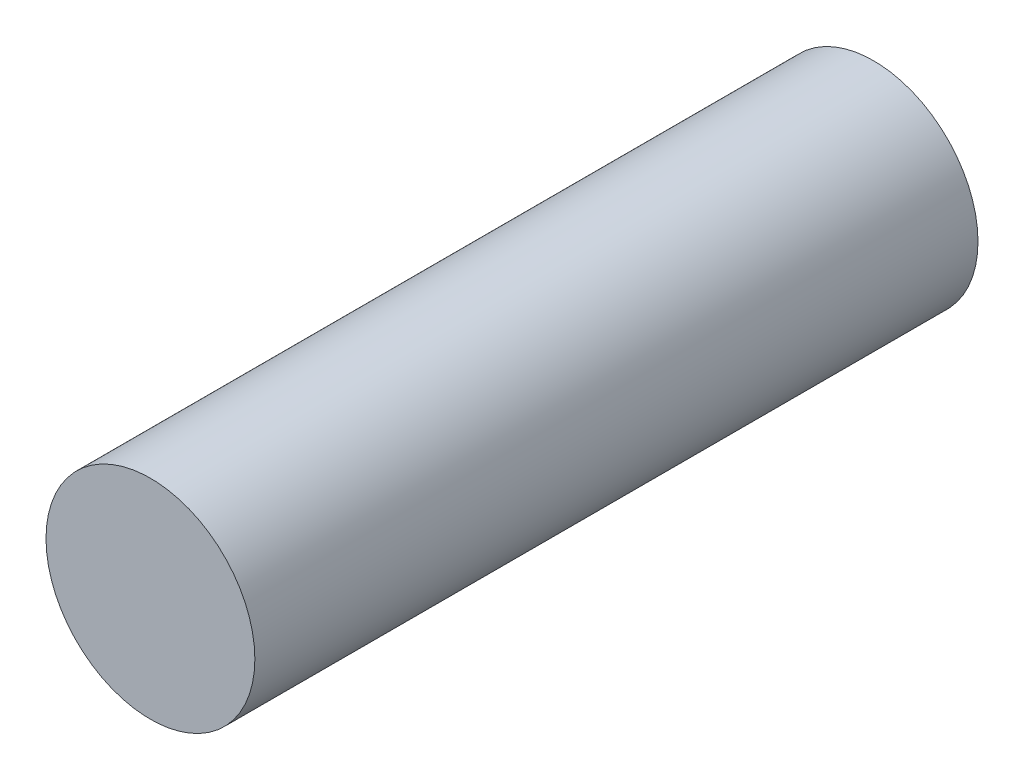
ISO-10303-21;
HEADER;
FILE_DESCRIPTION(('STEP AP214'),'2;1');
FILE_NAME('part.step','',(''),(''),'','','');
FILE_SCHEMA(('AUTOMOTIVE_DESIGN { 1 0 10303 214 1 1 1 1 }'));
ENDSEC;
DATA;
#1=APPLICATION_CONTEXT('core data for automotive mechanical design processes');
#2=APPLICATION_PROTOCOL_DEFINITION('international standard','automotive_design',2000,#1);
#3=PRODUCT_CONTEXT('',#1,'mechanical');
#4=PRODUCT('Part','Part','',(#3));
#5=PRODUCT_RELATED_PRODUCT_CATEGORY('part','',(#4));
#6=PRODUCT_DEFINITION_FORMATION('','',#4);
#7=PRODUCT_DEFINITION_CONTEXT('part definition',#1,'design');
#8=PRODUCT_DEFINITION('design','',#6,#7);
#9=PRODUCT_DEFINITION_SHAPE('','',#8);
#10=(LENGTH_UNIT() NAMED_UNIT(*) SI_UNIT(.MILLI.,.METRE.));
#11=(NAMED_UNIT(*) PLANE_ANGLE_UNIT() SI_UNIT($,.RADIAN.));
#12=(NAMED_UNIT(*) SI_UNIT($,.STERADIAN.) SOLID_ANGLE_UNIT());
#13=UNCERTAINTY_MEASURE_WITH_UNIT(LENGTH_MEASURE(1.E-05),#10,'distance_accuracy_value','');
#14=(GEOMETRIC_REPRESENTATION_CONTEXT(3) GLOBAL_UNCERTAINTY_ASSIGNED_CONTEXT((#13)) GLOBAL_UNIT_ASSIGNED_CONTEXT((#10,
#11,#12)) REPRESENTATION_CONTEXT('',''));
#15=CARTESIAN_POINT('',(0.,0.,0.));
#16=DIRECTION('',(0.,0.,1.));
#17=DIRECTION('',(1.,0.,0.));
#18=AXIS2_PLACEMENT_3D('',#15,#16,#17);
#19=CARTESIAN_POINT('',(835.472537528119,1521.39041399325,2165.74417925125));
#20=DIRECTION('',(0.,0.,-1.));
#21=DIRECTION('',(-1.,0.,0.));
#22=AXIS2_PLACEMENT_3D('',#19,#20,#21);
#23=PLANE('',#22);
#24=CARTESIAN_POINT('',(835.472537528119,1521.39041399325,2165.74417925125));
#25=DIRECTION('',(0.,0.,-1.));
#26=DIRECTION('',(-1.,0.,0.));
#27=AXIS2_PLACEMENT_3D('',#24,#25,#26);
#28=CIRCLE('',#27,1.58749999999996);
#29=CARTESIAN_POINT('',(833.885037528119,1521.39041399325,2165.74417925125));
#30=VERTEX_POINT('',#29);
#31=EDGE_CURVE('E24',#30,#30,#28,.T.);
#32=ORIENTED_EDGE('',*,*,#31,.F.);
#33=EDGE_LOOP('',(#32));
#34=FACE_BOUND('',#33,.T.);
#35=ADVANCED_FACE('F17',(#34),#23,.F.);
#36=CARTESIAN_POINT('',(835.472537528119,1521.39041399325,2154.75121676369));
#37=DIRECTION('',(0.,0.,-1.));
#38=DIRECTION('',(-1.,0.,0.));
#39=AXIS2_PLACEMENT_3D('',#36,#37,#38);
#40=PLANE('',#39);
#41=CARTESIAN_POINT('',(835.472537528119,1521.39041399325,2154.75121676369));
#42=DIRECTION('',(0.,0.,-1.));
#43=DIRECTION('',(-1.,0.,0.));
#44=AXIS2_PLACEMENT_3D('',#41,#42,#43);
#45=CIRCLE('',#44,1.58749999999996);
#46=CARTESIAN_POINT('',(833.885037528119,1521.39041399325,2154.75121676369));
#47=VERTEX_POINT('',#46);
#48=EDGE_CURVE('E11',#47,#47,#45,.T.);
#49=ORIENTED_EDGE('',*,*,#48,.T.);
#50=EDGE_LOOP('',(#49));
#51=FACE_BOUND('',#50,.T.);
#52=ADVANCED_FACE('F31',(#51),#40,.T.);
#53=CARTESIAN_POINT('',(835.472537528119,1521.39041399325,2165.74417925125));
#54=DIRECTION('',(0.,0.,-1.));
#55=DIRECTION('',(-1.,0.,0.));
#56=AXIS2_PLACEMENT_3D('',#53,#54,#55);
#57=CYLINDRICAL_SURFACE('',#56,1.58749999999996);
#58=ORIENTED_EDGE('',*,*,#48,.F.);
#59=EDGE_LOOP('',(#58));
#60=FACE_BOUND('',#59,.T.);
#61=ORIENTED_EDGE('',*,*,#31,.T.);
#62=EDGE_LOOP('',(#61));
#63=FACE_BOUND('',#62,.T.);
#64=ADVANCED_FACE('F33',(#60,#63),#57,.T.);
#65=CLOSED_SHELL('',(#35,#52,#64));
#66=MANIFOLD_SOLID_BREP('B1',#65);
#67=ADVANCED_BREP_SHAPE_REPRESENTATION('',(#18,#66),#14);
#68=SHAPE_DEFINITION_REPRESENTATION(#9,#67);
ENDSEC;
END-ISO-10303-21;
